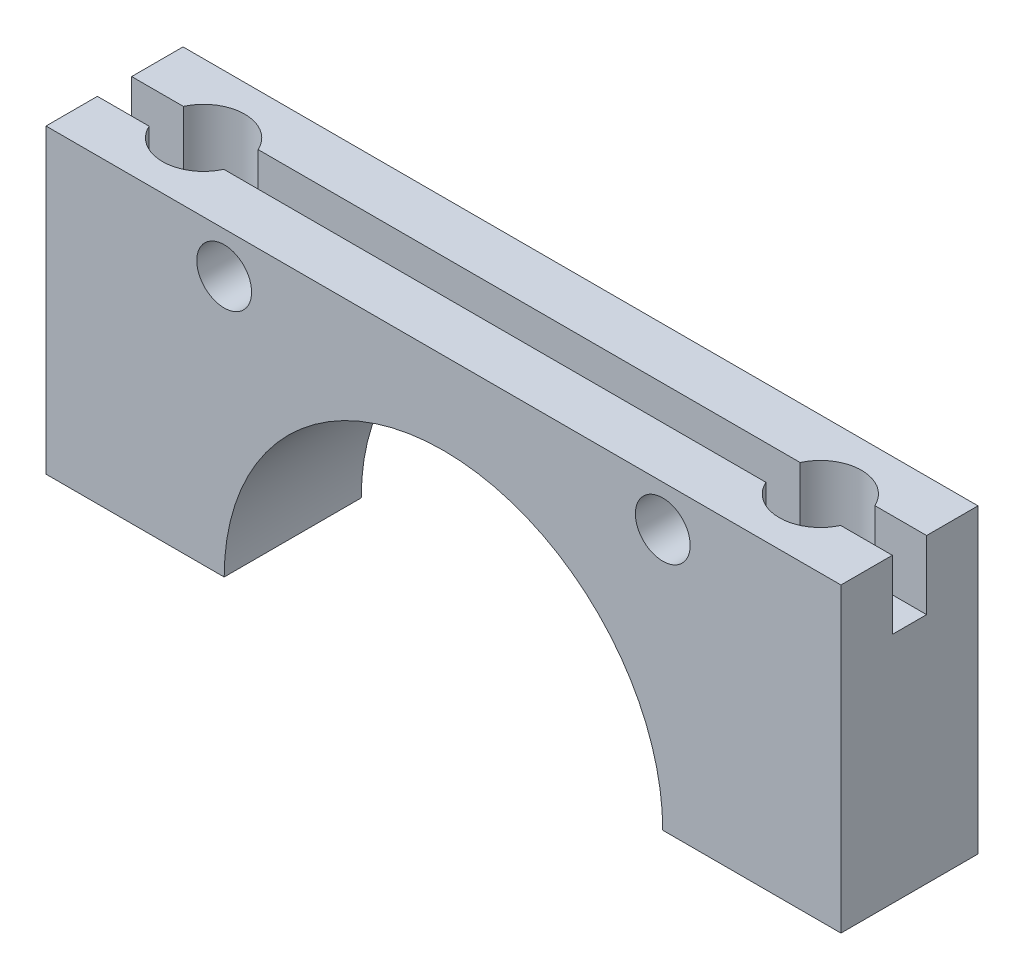
ISO-10303-21;
HEADER;
FILE_DESCRIPTION(('STEP AP214'),'2;1');
FILE_NAME('part.step','',(''),(''),'','','');
FILE_SCHEMA(('AUTOMOTIVE_DESIGN { 1 0 10303 214 1 1 1 1 }'));
ENDSEC;
DATA;
#1=APPLICATION_CONTEXT('core data for automotive mechanical design processes');
#2=APPLICATION_PROTOCOL_DEFINITION('international standard','automotive_design',2000,#1);
#3=PRODUCT_CONTEXT('',#1,'mechanical');
#4=PRODUCT('Part','Part','',(#3));
#5=PRODUCT_RELATED_PRODUCT_CATEGORY('part','',(#4));
#6=PRODUCT_DEFINITION_FORMATION('','',#4);
#7=PRODUCT_DEFINITION_CONTEXT('part definition',#1,'design');
#8=PRODUCT_DEFINITION('design','',#6,#7);
#9=PRODUCT_DEFINITION_SHAPE('','',#8);
#10=(LENGTH_UNIT() NAMED_UNIT(*) SI_UNIT(.MILLI.,.METRE.));
#11=(NAMED_UNIT(*) PLANE_ANGLE_UNIT() SI_UNIT($,.RADIAN.));
#12=(NAMED_UNIT(*) SI_UNIT($,.STERADIAN.) SOLID_ANGLE_UNIT());
#13=UNCERTAINTY_MEASURE_WITH_UNIT(LENGTH_MEASURE(1.E-05),#10,'distance_accuracy_value','');
#14=(GEOMETRIC_REPRESENTATION_CONTEXT(3) GLOBAL_UNCERTAINTY_ASSIGNED_CONTEXT((#13)) GLOBAL_UNIT_ASSIGNED_CONTEXT((#10,
#11,#12)) REPRESENTATION_CONTEXT('',''));
#15=CARTESIAN_POINT('',(0.,0.,0.));
#16=DIRECTION('',(0.,0.,1.));
#17=DIRECTION('',(1.,0.,0.));
#18=AXIS2_PLACEMENT_3D('',#15,#16,#17);
#19=CARTESIAN_POINT('',(-69.3342781396671,28.5744667064877,10.));
#20=DIRECTION('',(0.,-1.,0.));
#21=DIRECTION('',(0.,0.,-1.));
#22=AXIS2_PLACEMENT_3D('',#19,#20,#21);
#23=PLANE('',#22);
#24=DIRECTION('',(0.,0.,-1.));
#25=VECTOR('',#24,1.);
#26=CARTESIAN_POINT('',(-69.3342781396671,28.5744667064877,10.));
#27=LINE('',#26,#25);
#28=CARTESIAN_POINT('',(-69.3342781396671,28.5744667064877,3.75));
#29=VERTEX_POINT('',#28);
#30=CARTESIAN_POINT('',(-69.3342781396671,28.5744667064877,0.));
#31=VERTEX_POINT('',#30);
#32=EDGE_CURVE('E283',#29,#31,#27,.T.);
#33=ORIENTED_EDGE('',*,*,#32,.F.);
#34=DIRECTION('',(-1.,0.,0.));
#35=VECTOR('',#34,1.);
#36=CARTESIAN_POINT('',(-69.3342781396671,28.5744667064877,3.75));
#37=LINE('',#36,#35);
#38=CARTESIAN_POINT('',(-65.561456168326,28.5744667064877,3.75));
#39=VERTEX_POINT('',#38);
#40=EDGE_CURVE('E315',#39,#29,#37,.T.);
#41=ORIENTED_EDGE('',*,*,#40,.F.);
#42=CARTESIAN_POINT('',(-62.8342781396671,28.5744667064877,5.));
#43=DIRECTION('',(0.,1.,0.));
#44=DIRECTION('',(0.,0.,1.));
#45=AXIS2_PLACEMENT_3D('',#42,#43,#44);
#46=CIRCLE('',#45,3.);
#47=CARTESIAN_POINT('',(-60.1071001110082,28.5744667064877,3.75));
#48=VERTEX_POINT('',#47);
#49=EDGE_CURVE('E223',#48,#39,#46,.T.);
#50=ORIENTED_EDGE('',*,*,#49,.F.);
#51=CARTESIAN_POINT('',(-20.561456168326,28.5744667064877,3.75));
#52=VERTEX_POINT('',#51);
#53=EDGE_CURVE('E318',#52,#48,#37,.T.);
#54=ORIENTED_EDGE('',*,*,#53,.F.);
#55=CARTESIAN_POINT('',(-17.8342781396671,28.5744667064877,5.));
#56=DIRECTION('',(0.,1.,0.));
#57=DIRECTION('',(0.,0.,1.));
#58=AXIS2_PLACEMENT_3D('',#55,#56,#57);
#59=CIRCLE('',#58,3.);
#60=CARTESIAN_POINT('',(-15.1071001110082,28.5744667064877,3.75));
#61=VERTEX_POINT('',#60);
#62=EDGE_CURVE('E230',#61,#52,#59,.T.);
#63=ORIENTED_EDGE('',*,*,#62,.F.);
#64=CARTESIAN_POINT('',(-11.3342781396671,28.5744667064877,3.75));
#65=VERTEX_POINT('',#64);
#66=EDGE_CURVE('E188',#65,#61,#37,.T.);
#67=ORIENTED_EDGE('',*,*,#66,.F.);
#68=DIRECTION('',(0.,0.,-1.));
#69=VECTOR('',#68,1.);
#70=CARTESIAN_POINT('',(-11.3342781396671,28.5744667064877,10.));
#71=LINE('',#70,#69);
#72=CARTESIAN_POINT('',(-11.3342781396671,28.5744667064877,0.));
#73=VERTEX_POINT('',#72);
#74=EDGE_CURVE('E255',#65,#73,#71,.T.);
#75=ORIENTED_EDGE('',*,*,#74,.T.);
#76=DIRECTION('',(-1.,0.,0.));
#77=VECTOR('',#76,1.);
#78=CARTESIAN_POINT('',(-69.3342781396671,28.5744667064877,0.));
#79=LINE('',#78,#77);
#80=EDGE_CURVE('E236',#73,#31,#79,.T.);
#81=ORIENTED_EDGE('',*,*,#80,.T.);
#82=EDGE_LOOP('',(#33,#41,#50,#54,#63,#67,#75,#81));
#83=FACE_BOUND('',#82,.T.);
#84=ADVANCED_FACE('F36',(#83),#23,.F.);
#85=CARTESIAN_POINT('',(-17.8342781396671,33.5744667064877,5.));
#86=DIRECTION('',(0.,-1.,0.));
#87=DIRECTION('',(0.,0.,-1.));
#88=AXIS2_PLACEMENT_3D('',#85,#86,#87);
#89=CYLINDRICAL_SURFACE('',#88,1.6);
#90=CARTESIAN_POINT('',(-17.8342781396671,6.57446670648769,5.));
#91=DIRECTION('',(0.,-1.,0.));
#92=DIRECTION('',(0.,0.,-1.));
#93=AXIS2_PLACEMENT_3D('',#90,#91,#92);
#94=CIRCLE('',#93,1.6);
#95=CARTESIAN_POINT('',(-17.8342781396671,6.57446670648769,3.4));
#96=VERTEX_POINT('',#95);
#97=EDGE_CURVE('E237',#96,#96,#94,.T.);
#98=ORIENTED_EDGE('',*,*,#97,.T.);
#99=EDGE_LOOP('',(#98));
#100=FACE_BOUND('',#99,.T.);
#101=CARTESIAN_POINT('',(-17.8342781396671,13.5744667064877,5.));
#102=DIRECTION('',(0.,1.,0.));
#103=DIRECTION('',(0.,0.,1.));
#104=AXIS2_PLACEMENT_3D('',#101,#102,#103);
#105=CIRCLE('',#104,1.6);
#106=CARTESIAN_POINT('',(-17.8342781396671,13.5744667064877,6.6));
#107=VERTEX_POINT('',#106);
#108=EDGE_CURVE('E240',#107,#107,#105,.F.);
#109=ORIENTED_EDGE('',*,*,#108,.F.);
#110=EDGE_LOOP('',(#109));
#111=FACE_BOUND('',#110,.T.);
#112=ADVANCED_FACE('F406',(#100,#111),#89,.F.);
#113=CARTESIAN_POINT('',(-62.8342781396671,33.5744667064877,5.));
#114=DIRECTION('',(0.,-1.,0.));
#115=DIRECTION('',(0.,0.,-1.));
#116=AXIS2_PLACEMENT_3D('',#113,#114,#115);
#117=CYLINDRICAL_SURFACE('',#116,1.6);
#118=CARTESIAN_POINT('',(-62.8342781396671,6.57446670648769,5.));
#119=DIRECTION('',(0.,-1.,0.));
#120=DIRECTION('',(0.,0.,-1.));
#121=AXIS2_PLACEMENT_3D('',#118,#119,#120);
#122=CIRCLE('',#121,1.6);
#123=CARTESIAN_POINT('',(-62.8342781396671,6.57446670648769,3.4));
#124=VERTEX_POINT('',#123);
#125=EDGE_CURVE('E233',#124,#124,#122,.T.);
#126=ORIENTED_EDGE('',*,*,#125,.T.);
#127=EDGE_LOOP('',(#126));
#128=FACE_BOUND('',#127,.T.);
#129=CARTESIAN_POINT('',(-62.8342781396671,13.5744667064877,5.));
#130=DIRECTION('',(0.,1.,0.));
#131=DIRECTION('',(0.,0.,1.));
#132=AXIS2_PLACEMENT_3D('',#129,#130,#131);
#133=CIRCLE('',#132,1.6);
#134=CARTESIAN_POINT('',(-62.8342781396671,13.5744667064877,6.6));
#135=VERTEX_POINT('',#134);
#136=EDGE_CURVE('E222',#135,#135,#133,.F.);
#137=ORIENTED_EDGE('',*,*,#136,.F.);
#138=EDGE_LOOP('',(#137));
#139=FACE_BOUND('',#138,.T.);
#140=ADVANCED_FACE('F410',(#128,#139),#117,.F.);
#141=CARTESIAN_POINT('',(-11.3342781396671,28.5744667064877,10.));
#142=VERTEX_POINT('',#141);
#143=CARTESIAN_POINT('',(-11.3342781396671,28.5744667064877,6.25));
#144=VERTEX_POINT('',#143);
#145=EDGE_CURVE('E268',#142,#144,#71,.T.);
#146=ORIENTED_EDGE('',*,*,#145,.T.);
#147=DIRECTION('',(1.,0.,0.));
#148=VECTOR('',#147,1.);
#149=CARTESIAN_POINT('',(-69.3342781396671,28.5744667064877,6.25));
#150=LINE('',#149,#148);
#151=CARTESIAN_POINT('',(-15.1071001110082,28.5744667064877,6.25));
#152=VERTEX_POINT('',#151);
#153=EDGE_CURVE('E303',#152,#144,#150,.T.);
#154=ORIENTED_EDGE('',*,*,#153,.F.);
#155=CARTESIAN_POINT('',(-20.561456168326,28.5744667064877,6.25));
#156=VERTEX_POINT('',#155);
#157=EDGE_CURVE('E218',#156,#152,#59,.T.);
#158=ORIENTED_EDGE('',*,*,#157,.F.);
#159=CARTESIAN_POINT('',(-60.1071001110082,28.5744667064877,6.25));
#160=VERTEX_POINT('',#159);
#161=EDGE_CURVE('E316',#160,#156,#150,.T.);
#162=ORIENTED_EDGE('',*,*,#161,.F.);
#163=CARTESIAN_POINT('',(-65.561456168326,28.5744667064877,6.25));
#164=VERTEX_POINT('',#163);
#165=EDGE_CURVE('E224',#164,#160,#46,.T.);
#166=ORIENTED_EDGE('',*,*,#165,.F.);
#167=CARTESIAN_POINT('',(-69.3342781396671,28.5744667064877,6.25));
#168=VERTEX_POINT('',#167);
#169=EDGE_CURVE('E313',#168,#164,#150,.T.);
#170=ORIENTED_EDGE('',*,*,#169,.F.);
#171=CARTESIAN_POINT('',(-69.3342781396671,28.5744667064877,10.));
#172=VERTEX_POINT('',#171);
#173=EDGE_CURVE('E193',#172,#168,#27,.T.);
#174=ORIENTED_EDGE('',*,*,#173,.F.);
#175=DIRECTION('',(-1.,0.,0.));
#176=VECTOR('',#175,1.);
#177=CARTESIAN_POINT('',(-69.3342781396671,28.5744667064877,10.));
#178=LINE('',#177,#176);
#179=EDGE_CURVE('E241',#142,#172,#178,.T.);
#180=ORIENTED_EDGE('',*,*,#179,.F.);
#181=EDGE_LOOP('',(#146,#154,#158,#162,#166,#170,#174,#180));
#182=FACE_BOUND('',#181,.T.);
#183=ADVANCED_FACE('F38',(#182),#23,.F.);
#184=CARTESIAN_POINT('',(-69.3342781396671,6.57446670648769,10.));
#185=DIRECTION('',(1.,0.,0.));
#186=DIRECTION('',(0.,0.,-1.));
#187=AXIS2_PLACEMENT_3D('',#184,#185,#186);
#188=PLANE('',#187);
#189=DIRECTION('',(0.,0.,1.));
#190=VECTOR('',#189,1.);
#191=CARTESIAN_POINT('',(-69.3342781396671,23.5744667064877,3.75));
#192=LINE('',#191,#190);
#193=CARTESIAN_POINT('',(-69.3342781396671,23.5744667064877,3.75));
#194=VERTEX_POINT('',#193);
#195=CARTESIAN_POINT('',(-69.3342781396671,23.5744667064877,6.25));
#196=VERTEX_POINT('',#195);
#197=EDGE_CURVE('E180',#194,#196,#192,.T.);
#198=ORIENTED_EDGE('',*,*,#197,.F.);
#199=DIRECTION('',(0.,1.,0.));
#200=VECTOR('',#199,1.);
#201=CARTESIAN_POINT('',(-69.3342781396671,23.5744667064877,3.75));
#202=LINE('',#201,#200);
#203=EDGE_CURVE('E207',#194,#29,#202,.T.);
#204=ORIENTED_EDGE('',*,*,#203,.T.);
#205=ORIENTED_EDGE('',*,*,#32,.T.);
#206=DIRECTION('',(0.,-1.,0.));
#207=VECTOR('',#206,1.);
#208=CARTESIAN_POINT('',(-69.3342781396671,6.57446670648769,0.));
#209=LINE('',#208,#207);
#210=CARTESIAN_POINT('',(-69.3342781396671,6.57446670648769,0.));
#211=VERTEX_POINT('',#210);
#212=EDGE_CURVE('E258',#31,#211,#209,.T.);
#213=ORIENTED_EDGE('',*,*,#212,.T.);
#214=DIRECTION('',(0.,0.,-1.));
#215=VECTOR('',#214,1.);
#216=CARTESIAN_POINT('',(-69.3342781396671,6.57446670648769,10.));
#217=LINE('',#216,#215);
#218=CARTESIAN_POINT('',(-69.3342781396671,6.57446670648769,10.));
#219=VERTEX_POINT('',#218);
#220=EDGE_CURVE('E280',#219,#211,#217,.T.);
#221=ORIENTED_EDGE('',*,*,#220,.F.);
#222=DIRECTION('',(0.,-1.,0.));
#223=VECTOR('',#222,1.);
#224=CARTESIAN_POINT('',(-69.3342781396671,6.57446670648769,10.));
#225=LINE('',#224,#223);
#226=EDGE_CURVE('E244',#172,#219,#225,.T.);
#227=ORIENTED_EDGE('',*,*,#226,.F.);
#228=ORIENTED_EDGE('',*,*,#173,.T.);
#229=DIRECTION('',(0.,1.,0.));
#230=VECTOR('',#229,1.);
#231=CARTESIAN_POINT('',(-69.3342781396671,23.5744667064877,6.25));
#232=LINE('',#231,#230);
#233=EDGE_CURVE('E169',#196,#168,#232,.T.);
#234=ORIENTED_EDGE('',*,*,#233,.F.);
#235=EDGE_LOOP('',(#198,#204,#205,#213,#221,#227,#228,#234));
#236=FACE_BOUND('',#235,.T.);
#237=ADVANCED_FACE('F191',(#236),#188,.F.);
#238=CARTESIAN_POINT('',(-69.3342781396671,6.57446670648769,10.));
#239=DIRECTION('',(0.,1.,0.));
#240=DIRECTION('',(0.,0.,1.));
#241=AXIS2_PLACEMENT_3D('',#238,#239,#240);
#242=PLANE('',#241);
#243=ORIENTED_EDGE('',*,*,#125,.F.);
#244=EDGE_LOOP('',(#243));
#245=FACE_BOUND('',#244,.T.);
#246=DIRECTION('',(1.,0.,0.));
#247=VECTOR('',#246,1.);
#248=CARTESIAN_POINT('',(-69.3342781396671,6.57446670648769,0.));
#249=LINE('',#248,#247);
#250=CARTESIAN_POINT('',(-56.3342781396671,6.57446670648769,0.));
#251=VERTEX_POINT('',#250);
#252=EDGE_CURVE('E260',#211,#251,#249,.T.);
#253=ORIENTED_EDGE('',*,*,#252,.T.);
#254=DIRECTION('',(0.,0.,-1.));
#255=VECTOR('',#254,1.);
#256=CARTESIAN_POINT('',(-56.3342781396671,6.57446670648769,10.));
#257=LINE('',#256,#255);
#258=CARTESIAN_POINT('',(-56.3342781396671,6.57446670648769,10.));
#259=VERTEX_POINT('',#258);
#260=EDGE_CURVE('E277',#259,#251,#257,.T.);
#261=ORIENTED_EDGE('',*,*,#260,.F.);
#262=DIRECTION('',(1.,0.,0.));
#263=VECTOR('',#262,1.);
#264=CARTESIAN_POINT('',(-69.3342781396671,6.57446670648769,10.));
#265=LINE('',#264,#263);
#266=EDGE_CURVE('E247',#219,#259,#265,.T.);
#267=ORIENTED_EDGE('',*,*,#266,.F.);
#268=ORIENTED_EDGE('',*,*,#220,.T.);
#269=EDGE_LOOP('',(#253,#261,#267,#268));
#270=FACE_BOUND('',#269,.T.);
#271=ADVANCED_FACE('F395',(#245,#270),#242,.F.);
#272=CARTESIAN_POINT('',(-40.3342781396671,6.57446670648769,10.));
#273=DIRECTION('',(0.,0.,-1.));
#274=DIRECTION('',(-1.,0.,0.));
#275=AXIS2_PLACEMENT_3D('',#272,#273,#274);
#276=CYLINDRICAL_SURFACE('',#275,16.);
#277=CARTESIAN_POINT('',(-40.3342781396671,6.57446670648769,0.));
#278=DIRECTION('',(0.,0.,-1.));
#279=DIRECTION('',(-1.,0.,0.));
#280=AXIS2_PLACEMENT_3D('',#277,#278,#279);
#281=CIRCLE('',#280,16.);
#282=CARTESIAN_POINT('',(-24.3342781396671,6.57446670648769,0.));
#283=VERTEX_POINT('',#282);
#284=EDGE_CURVE('E262',#251,#283,#281,.T.);
#285=ORIENTED_EDGE('',*,*,#284,.T.);
#286=DIRECTION('',(0.,0.,-1.));
#287=VECTOR('',#286,1.);
#288=CARTESIAN_POINT('',(-24.3342781396671,6.57446670648769,10.));
#289=LINE('',#288,#287);
#290=CARTESIAN_POINT('',(-24.3342781396671,6.57446670648769,10.));
#291=VERTEX_POINT('',#290);
#292=EDGE_CURVE('E274',#291,#283,#289,.T.);
#293=ORIENTED_EDGE('',*,*,#292,.F.);
#294=CARTESIAN_POINT('',(-40.3342781396671,6.57446670648769,10.));
#295=DIRECTION('',(0.,0.,-1.));
#296=DIRECTION('',(-1.,0.,0.));
#297=AXIS2_PLACEMENT_3D('',#294,#295,#296);
#298=CIRCLE('',#297,16.);
#299=EDGE_CURVE('E249',#259,#291,#298,.T.);
#300=ORIENTED_EDGE('',*,*,#299,.F.);
#301=ORIENTED_EDGE('',*,*,#260,.T.);
#302=EDGE_LOOP('',(#285,#293,#300,#301));
#303=FACE_BOUND('',#302,.T.);
#304=ADVANCED_FACE('F391',(#303),#276,.F.);
#305=CARTESIAN_POINT('',(-11.3342781396671,6.57446670648769,10.));
#306=DIRECTION('',(0.,1.,0.));
#307=DIRECTION('',(0.,0.,1.));
#308=AXIS2_PLACEMENT_3D('',#305,#306,#307);
#309=PLANE('',#308);
#310=ORIENTED_EDGE('',*,*,#97,.F.);
#311=EDGE_LOOP('',(#310));
#312=FACE_BOUND('',#311,.T.);
#313=DIRECTION('',(1.,0.,0.));
#314=VECTOR('',#313,1.);
#315=CARTESIAN_POINT('',(-11.3342781396671,6.57446670648769,0.));
#316=LINE('',#315,#314);
#317=CARTESIAN_POINT('',(-11.3342781396671,6.57446670648769,0.));
#318=VERTEX_POINT('',#317);
#319=EDGE_CURVE('E264',#283,#318,#316,.T.);
#320=ORIENTED_EDGE('',*,*,#319,.T.);
#321=DIRECTION('',(0.,0.,-1.));
#322=VECTOR('',#321,1.);
#323=CARTESIAN_POINT('',(-11.3342781396671,6.57446670648769,10.));
#324=LINE('',#323,#322);
#325=CARTESIAN_POINT('',(-11.3342781396671,6.57446670648769,10.));
#326=VERTEX_POINT('',#325);
#327=EDGE_CURVE('E271',#326,#318,#324,.T.);
#328=ORIENTED_EDGE('',*,*,#327,.F.);
#329=DIRECTION('',(1.,0.,0.));
#330=VECTOR('',#329,1.);
#331=CARTESIAN_POINT('',(-11.3342781396671,6.57446670648769,10.));
#332=LINE('',#331,#330);
#333=EDGE_CURVE('E251',#291,#326,#332,.T.);
#334=ORIENTED_EDGE('',*,*,#333,.F.);
#335=ORIENTED_EDGE('',*,*,#292,.T.);
#336=EDGE_LOOP('',(#320,#328,#334,#335));
#337=FACE_BOUND('',#336,.T.);
#338=ADVANCED_FACE('F388',(#312,#337),#309,.F.);
#339=CARTESIAN_POINT('',(-11.3342781396671,28.5744667064877,10.));
#340=DIRECTION('',(-1.,0.,0.));
#341=DIRECTION('',(0.,0.,1.));
#342=AXIS2_PLACEMENT_3D('',#339,#340,#341);
#343=PLANE('',#342);
#344=ORIENTED_EDGE('',*,*,#74,.F.);
#345=DIRECTION('',(0.,1.,0.));
#346=VECTOR('',#345,1.);
#347=CARTESIAN_POINT('',(-11.3342781396671,23.5744667064877,3.75));
#348=LINE('',#347,#346);
#349=CARTESIAN_POINT('',(-11.3342781396671,23.5744667064877,3.75));
#350=VERTEX_POINT('',#349);
#351=EDGE_CURVE('E198',#350,#65,#348,.T.);
#352=ORIENTED_EDGE('',*,*,#351,.F.);
#353=DIRECTION('',(0.,0.,-1.));
#354=VECTOR('',#353,1.);
#355=CARTESIAN_POINT('',(-11.3342781396671,23.5744667064877,3.75));
#356=LINE('',#355,#354);
#357=CARTESIAN_POINT('',(-11.3342781396671,23.5744667064877,6.25));
#358=VERTEX_POINT('',#357);
#359=EDGE_CURVE('E175',#358,#350,#356,.T.);
#360=ORIENTED_EDGE('',*,*,#359,.F.);
#361=DIRECTION('',(0.,1.,0.));
#362=VECTOR('',#361,1.);
#363=CARTESIAN_POINT('',(-11.3342781396671,23.5744667064877,6.25));
#364=LINE('',#363,#362);
#365=EDGE_CURVE('E194',#358,#144,#364,.T.);
#366=ORIENTED_EDGE('',*,*,#365,.T.);
#367=ORIENTED_EDGE('',*,*,#145,.F.);
#368=DIRECTION('',(0.,1.,0.));
#369=VECTOR('',#368,1.);
#370=CARTESIAN_POINT('',(-11.3342781396671,28.5744667064877,10.));
#371=LINE('',#370,#369);
#372=EDGE_CURVE('E253',#326,#142,#371,.T.);
#373=ORIENTED_EDGE('',*,*,#372,.F.);
#374=ORIENTED_EDGE('',*,*,#327,.T.);
#375=DIRECTION('',(0.,1.,0.));
#376=VECTOR('',#375,1.);
#377=CARTESIAN_POINT('',(-11.3342781396671,28.5744667064877,0.));
#378=LINE('',#377,#376);
#379=EDGE_CURVE('E245',#318,#73,#378,.T.);
#380=ORIENTED_EDGE('',*,*,#379,.T.);
#381=EDGE_LOOP('',(#344,#352,#360,#366,#367,#373,#374,#380));
#382=FACE_BOUND('',#381,.T.);
#383=ADVANCED_FACE('F333',(#382),#343,.F.);
#384=CARTESIAN_POINT('',(-40.3342781396671,6.57446670648769,10.));
#385=DIRECTION('',(0.,0.,-1.));
#386=DIRECTION('',(-1.,0.,0.));
#387=AXIS2_PLACEMENT_3D('',#384,#385,#386);
#388=PLANE('',#387);
#389=CARTESIAN_POINT('',(-56.3342781396671,25.5744667064877,10.));
#390=DIRECTION('',(0.,0.,1.));
#391=DIRECTION('',(1.,0.,0.));
#392=AXIS2_PLACEMENT_3D('',#389,#390,#391);
#393=CIRCLE('',#392,2.);
#394=CARTESIAN_POINT('',(-54.3342781396671,25.5744667064877,10.));
#395=VERTEX_POINT('',#394);
#396=EDGE_CURVE('E299',#395,#395,#393,.T.);
#397=ORIENTED_EDGE('',*,*,#396,.F.);
#398=EDGE_LOOP('',(#397));
#399=FACE_BOUND('',#398,.T.);
#400=CARTESIAN_POINT('',(-24.3342781396671,25.5744667064877,10.));
#401=DIRECTION('',(0.,0.,1.));
#402=DIRECTION('',(1.,0.,0.));
#403=AXIS2_PLACEMENT_3D('',#400,#401,#402);
#404=CIRCLE('',#403,2.);
#405=CARTESIAN_POINT('',(-22.3342781396671,25.5744667064877,10.));
#406=VERTEX_POINT('',#405);
#407=EDGE_CURVE('E305',#406,#406,#404,.T.);
#408=ORIENTED_EDGE('',*,*,#407,.F.);
#409=EDGE_LOOP('',(#408));
#410=FACE_BOUND('',#409,.T.);
#411=ORIENTED_EDGE('',*,*,#179,.T.);
#412=ORIENTED_EDGE('',*,*,#226,.T.);
#413=ORIENTED_EDGE('',*,*,#266,.T.);
#414=ORIENTED_EDGE('',*,*,#299,.T.);
#415=ORIENTED_EDGE('',*,*,#333,.T.);
#416=ORIENTED_EDGE('',*,*,#372,.T.);
#417=EDGE_LOOP('',(#411,#412,#413,#414,#415,#416));
#418=FACE_BOUND('',#417,.T.);
#419=ADVANCED_FACE('F383',(#399,#410,#418),#388,.F.);
#420=CARTESIAN_POINT('',(-40.3342781396671,6.57446670648769,0.));
#421=DIRECTION('',(0.,0.,-1.));
#422=DIRECTION('',(-1.,0.,0.));
#423=AXIS2_PLACEMENT_3D('',#420,#421,#422);
#424=PLANE('',#423);
#425=ORIENTED_EDGE('',*,*,#80,.F.);
#426=ORIENTED_EDGE('',*,*,#379,.F.);
#427=ORIENTED_EDGE('',*,*,#319,.F.);
#428=ORIENTED_EDGE('',*,*,#284,.F.);
#429=ORIENTED_EDGE('',*,*,#252,.F.);
#430=ORIENTED_EDGE('',*,*,#212,.F.);
#431=EDGE_LOOP('',(#425,#426,#427,#428,#429,#430));
#432=FACE_BOUND('',#431,.T.);
#433=ADVANCED_FACE('F341',(#432),#424,.T.);
#434=CARTESIAN_POINT('',(-62.8342781396671,13.5744667064877,5.));
#435=DIRECTION('',(0.,1.,0.));
#436=DIRECTION('',(0.,0.,1.));
#437=AXIS2_PLACEMENT_3D('',#434,#435,#436);
#438=PLANE('',#437);
#439=CARTESIAN_POINT('',(-62.8342781396671,13.5744667064877,5.));
#440=DIRECTION('',(0.,1.,0.));
#441=DIRECTION('',(0.,0.,1.));
#442=AXIS2_PLACEMENT_3D('',#439,#440,#441);
#443=CIRCLE('',#442,3.);
#444=CARTESIAN_POINT('',(-62.8342781396671,13.5744667064877,8.));
#445=VERTEX_POINT('',#444);
#446=EDGE_CURVE('E219',#445,#445,#443,.T.);
#447=ORIENTED_EDGE('',*,*,#446,.T.);
#448=EDGE_LOOP('',(#447));
#449=FACE_BOUND('',#448,.T.);
#450=ORIENTED_EDGE('',*,*,#136,.T.);
#451=EDGE_LOOP('',(#450));
#452=FACE_BOUND('',#451,.T.);
#453=ADVANCED_FACE('F430',(#449,#452),#438,.T.);
#454=CARTESIAN_POINT('',(-62.8342781396671,13.5744667064877,5.));
#455=DIRECTION('',(0.,1.,0.));
#456=DIRECTION('',(0.,0.,1.));
#457=AXIS2_PLACEMENT_3D('',#454,#455,#456);
#458=CYLINDRICAL_SURFACE('',#457,3.);
#459=ORIENTED_EDGE('',*,*,#49,.T.);
#460=DIRECTION('',(0.,1.,0.));
#461=VECTOR('',#460,1.);
#462=CARTESIAN_POINT('',(-65.561456168326,13.5744667064877,3.75));
#463=LINE('',#462,#461);
#464=CARTESIAN_POINT('',(-65.561456168326,23.5744667064877,3.75));
#465=VERTEX_POINT('',#464);
#466=EDGE_CURVE('E215',#39,#465,#463,.F.);
#467=ORIENTED_EDGE('',*,*,#466,.T.);
#468=CARTESIAN_POINT('',(-62.8342781396671,23.5744667064877,5.));
#469=DIRECTION('',(0.,1.,0.));
#470=DIRECTION('',(0.,0.,1.));
#471=AXIS2_PLACEMENT_3D('',#468,#469,#470);
#472=CIRCLE('',#471,3.);
#473=CARTESIAN_POINT('',(-65.561456168326,23.5744667064877,6.25));
#474=VERTEX_POINT('',#473);
#475=EDGE_CURVE('E206',#474,#465,#472,.F.);
#476=ORIENTED_EDGE('',*,*,#475,.F.);
#477=DIRECTION('',(0.,1.,0.));
#478=VECTOR('',#477,1.);
#479=CARTESIAN_POINT('',(-65.561456168326,13.5744667064877,6.25));
#480=LINE('',#479,#478);
#481=EDGE_CURVE('E172',#474,#164,#480,.T.);
#482=ORIENTED_EDGE('',*,*,#481,.T.);
#483=ORIENTED_EDGE('',*,*,#165,.T.);
#484=DIRECTION('',(0.,1.,0.));
#485=VECTOR('',#484,1.);
#486=CARTESIAN_POINT('',(-60.1071001110082,13.5744667064877,6.25));
#487=LINE('',#486,#485);
#488=CARTESIAN_POINT('',(-60.1071001110082,23.5744667064877,6.25));
#489=VERTEX_POINT('',#488);
#490=EDGE_CURVE('E209',#160,#489,#487,.F.);
#491=ORIENTED_EDGE('',*,*,#490,.T.);
#492=CARTESIAN_POINT('',(-60.1071001110082,23.5744667064877,3.75));
#493=VERTEX_POINT('',#492);
#494=EDGE_CURVE('E204',#493,#489,#472,.F.);
#495=ORIENTED_EDGE('',*,*,#494,.F.);
#496=DIRECTION('',(0.,1.,0.));
#497=VECTOR('',#496,1.);
#498=CARTESIAN_POINT('',(-60.1071001110082,13.5744667064877,3.75));
#499=LINE('',#498,#497);
#500=EDGE_CURVE('E212',#493,#48,#499,.T.);
#501=ORIENTED_EDGE('',*,*,#500,.T.);
#502=EDGE_LOOP('',(#459,#467,#476,#482,#483,#491,#495,#501));
#503=FACE_BOUND('',#502,.T.);
#504=ORIENTED_EDGE('',*,*,#446,.F.);
#505=EDGE_LOOP('',(#504));
#506=FACE_BOUND('',#505,.T.);
#507=ADVANCED_FACE('F355',(#503,#506),#458,.F.);
#508=CARTESIAN_POINT('',(-17.8342781396671,13.5744667064877,5.));
#509=DIRECTION('',(0.,1.,0.));
#510=DIRECTION('',(0.,0.,1.));
#511=AXIS2_PLACEMENT_3D('',#508,#509,#510);
#512=PLANE('',#511);
#513=CARTESIAN_POINT('',(-17.8342781396671,13.5744667064877,5.));
#514=DIRECTION('',(0.,1.,0.));
#515=DIRECTION('',(0.,0.,1.));
#516=AXIS2_PLACEMENT_3D('',#513,#514,#515);
#517=CIRCLE('',#516,3.);
#518=CARTESIAN_POINT('',(-17.8342781396671,13.5744667064877,8.));
#519=VERTEX_POINT('',#518);
#520=EDGE_CURVE('E227',#519,#519,#517,.T.);
#521=ORIENTED_EDGE('',*,*,#520,.T.);
#522=EDGE_LOOP('',(#521));
#523=FACE_BOUND('',#522,.T.);
#524=ORIENTED_EDGE('',*,*,#108,.T.);
#525=EDGE_LOOP('',(#524));
#526=FACE_BOUND('',#525,.T.);
#527=ADVANCED_FACE('F441',(#523,#526),#512,.T.);
#528=CARTESIAN_POINT('',(-17.8342781396671,13.5744667064877,5.));
#529=DIRECTION('',(0.,1.,0.));
#530=DIRECTION('',(0.,0.,1.));
#531=AXIS2_PLACEMENT_3D('',#528,#529,#530);
#532=CYLINDRICAL_SURFACE('',#531,3.);
#533=ORIENTED_EDGE('',*,*,#62,.T.);
#534=DIRECTION('',(0.,1.,0.));
#535=VECTOR('',#534,1.);
#536=CARTESIAN_POINT('',(-20.561456168326,13.5744667064877,3.75));
#537=LINE('',#536,#535);
#538=CARTESIAN_POINT('',(-20.561456168326,23.5744667064877,3.75));
#539=VERTEX_POINT('',#538);
#540=EDGE_CURVE('E11',#52,#539,#537,.F.);
#541=ORIENTED_EDGE('',*,*,#540,.T.);
#542=CARTESIAN_POINT('',(-17.8342781396671,23.5744667064877,5.));
#543=DIRECTION('',(0.,1.,0.));
#544=DIRECTION('',(0.,0.,1.));
#545=AXIS2_PLACEMENT_3D('',#542,#543,#544);
#546=CIRCLE('',#545,3.);
#547=CARTESIAN_POINT('',(-20.561456168326,23.5744667064877,6.25));
#548=VERTEX_POINT('',#547);
#549=EDGE_CURVE('E292',#548,#539,#546,.F.);
#550=ORIENTED_EDGE('',*,*,#549,.F.);
#551=DIRECTION('',(0.,1.,0.));
#552=VECTOR('',#551,1.);
#553=CARTESIAN_POINT('',(-20.561456168326,13.5744667064877,6.25));
#554=LINE('',#553,#552);
#555=EDGE_CURVE('E45',#548,#156,#554,.T.);
#556=ORIENTED_EDGE('',*,*,#555,.T.);
#557=ORIENTED_EDGE('',*,*,#157,.T.);
#558=DIRECTION('',(0.,1.,0.));
#559=VECTOR('',#558,1.);
#560=CARTESIAN_POINT('',(-15.1071001110082,13.5744667064877,6.25));
#561=LINE('',#560,#559);
#562=CARTESIAN_POINT('',(-15.1071001110082,23.5744667064877,6.25));
#563=VERTEX_POINT('',#562);
#564=EDGE_CURVE('E291',#152,#563,#561,.F.);
#565=ORIENTED_EDGE('',*,*,#564,.T.);
#566=CARTESIAN_POINT('',(-15.1071001110082,23.5744667064877,3.75));
#567=VERTEX_POINT('',#566);
#568=EDGE_CURVE('E285',#567,#563,#546,.F.);
#569=ORIENTED_EDGE('',*,*,#568,.F.);
#570=DIRECTION('',(0.,1.,0.));
#571=VECTOR('',#570,1.);
#572=CARTESIAN_POINT('',(-15.1071001110082,13.5744667064877,3.75));
#573=LINE('',#572,#571);
#574=EDGE_CURVE('E295',#567,#61,#573,.T.);
#575=ORIENTED_EDGE('',*,*,#574,.T.);
#576=EDGE_LOOP('',(#533,#541,#550,#556,#557,#565,#569,#575));
#577=FACE_BOUND('',#576,.T.);
#578=ORIENTED_EDGE('',*,*,#520,.F.);
#579=EDGE_LOOP('',(#578));
#580=FACE_BOUND('',#579,.T.);
#581=ADVANCED_FACE('F372',(#577,#580),#532,.F.);
#582=CARTESIAN_POINT('',(0.,23.5744667064877,0.));
#583=DIRECTION('',(0.,1.,0.));
#584=DIRECTION('',(0.,0.,1.));
#585=AXIS2_PLACEMENT_3D('',#582,#583,#584);
#586=PLANE('',#585);
#587=ORIENTED_EDGE('',*,*,#568,.T.);
#588=DIRECTION('',(1.,0.,0.));
#589=VECTOR('',#588,1.);
#590=CARTESIAN_POINT('',(-69.3342781396671,23.5744667064877,6.25));
#591=LINE('',#590,#589);
#592=EDGE_CURVE('E187',#563,#358,#591,.T.);
#593=ORIENTED_EDGE('',*,*,#592,.T.);
#594=ORIENTED_EDGE('',*,*,#359,.T.);
#595=DIRECTION('',(-1.,0.,0.));
#596=VECTOR('',#595,1.);
#597=CARTESIAN_POINT('',(-69.3342781396671,23.5744667064877,3.75));
#598=LINE('',#597,#596);
#599=EDGE_CURVE('E195',#350,#567,#598,.T.);
#600=ORIENTED_EDGE('',*,*,#599,.T.);
#601=EDGE_LOOP('',(#587,#593,#594,#600));
#602=FACE_BOUND('',#601,.T.);
#603=ADVANCED_FACE('F375',(#602),#586,.T.);
#604=CARTESIAN_POINT('',(-69.3342781396671,23.5744667064877,6.25));
#605=DIRECTION('',(0.,0.,1.));
#606=DIRECTION('',(1.,0.,0.));
#607=AXIS2_PLACEMENT_3D('',#604,#605,#606);
#608=PLANE('',#607);
#609=ORIENTED_EDGE('',*,*,#153,.T.);
#610=ORIENTED_EDGE('',*,*,#365,.F.);
#611=ORIENTED_EDGE('',*,*,#592,.F.);
#612=ORIENTED_EDGE('',*,*,#564,.F.);
#613=EDGE_LOOP('',(#609,#610,#611,#612));
#614=FACE_BOUND('',#613,.T.);
#615=ADVANCED_FACE('F377',(#614),#608,.F.);
#616=CARTESIAN_POINT('',(-69.3342781396671,23.5744667064877,3.75));
#617=DIRECTION('',(0.,0.,-1.));
#618=DIRECTION('',(-1.,0.,0.));
#619=AXIS2_PLACEMENT_3D('',#616,#617,#618);
#620=PLANE('',#619);
#621=ORIENTED_EDGE('',*,*,#599,.F.);
#622=ORIENTED_EDGE('',*,*,#351,.T.);
#623=ORIENTED_EDGE('',*,*,#66,.T.);
#624=ORIENTED_EDGE('',*,*,#574,.F.);
#625=EDGE_LOOP('',(#621,#622,#623,#624));
#626=FACE_BOUND('',#625,.T.);
#627=ADVANCED_FACE('F323',(#626),#620,.F.);
#628=CARTESIAN_POINT('',(-56.3342781396671,23.5744667064877,6.25));
#629=VERTEX_POINT('',#628);
#630=EDGE_CURVE('E176',#489,#629,#591,.T.);
#631=ORIENTED_EDGE('',*,*,#630,.T.);
#632=CARTESIAN_POINT('',(-24.3342781396671,23.5744667064877,6.25));
#633=VERTEX_POINT('',#632);
#634=EDGE_CURVE('E364',#629,#633,#591,.T.);
#635=ORIENTED_EDGE('',*,*,#634,.T.);
#636=EDGE_CURVE('E178',#633,#548,#591,.T.);
#637=ORIENTED_EDGE('',*,*,#636,.T.);
#638=ORIENTED_EDGE('',*,*,#549,.T.);
#639=EDGE_CURVE('E200',#539,#493,#598,.T.);
#640=ORIENTED_EDGE('',*,*,#639,.T.);
#641=ORIENTED_EDGE('',*,*,#494,.T.);
#642=EDGE_LOOP('',(#631,#635,#637,#638,#640,#641));
#643=FACE_BOUND('',#642,.T.);
#644=ADVANCED_FACE('F360',(#643),#586,.T.);
#645=ORIENTED_EDGE('',*,*,#634,.F.);
#646=CARTESIAN_POINT('',(-56.3342781396671,25.5744667064877,6.25));
#647=DIRECTION('',(0.,0.,1.));
#648=DIRECTION('',(1.,0.,0.));
#649=AXIS2_PLACEMENT_3D('',#646,#647,#648);
#650=CIRCLE('',#649,2.);
#651=EDGE_CURVE('E40',#629,#629,#650,.T.);
#652=ORIENTED_EDGE('',*,*,#651,.T.);
#653=ORIENTED_EDGE('',*,*,#630,.F.);
#654=ORIENTED_EDGE('',*,*,#490,.F.);
#655=ORIENTED_EDGE('',*,*,#161,.T.);
#656=ORIENTED_EDGE('',*,*,#555,.F.);
#657=ORIENTED_EDGE('',*,*,#636,.F.);
#658=CARTESIAN_POINT('',(-24.3342781396671,25.5744667064877,6.25));
#659=DIRECTION('',(0.,0.,1.));
#660=DIRECTION('',(1.,0.,0.));
#661=AXIS2_PLACEMENT_3D('',#658,#659,#660);
#662=CIRCLE('',#661,2.);
#663=EDGE_CURVE('E51',#633,#633,#662,.T.);
#664=ORIENTED_EDGE('',*,*,#663,.T.);
#665=EDGE_LOOP('',(#645,#652,#653,#654,#655,#656,#657,#664));
#666=FACE_BOUND('',#665,.T.);
#667=ADVANCED_FACE('F362',(#666),#608,.F.);
#668=ORIENTED_EDGE('',*,*,#639,.F.);
#669=ORIENTED_EDGE('',*,*,#540,.F.);
#670=ORIENTED_EDGE('',*,*,#53,.T.);
#671=ORIENTED_EDGE('',*,*,#500,.F.);
#672=EDGE_LOOP('',(#668,#669,#670,#671));
#673=FACE_BOUND('',#672,.T.);
#674=ADVANCED_FACE('F351',(#673),#620,.F.);
#675=ORIENTED_EDGE('',*,*,#40,.T.);
#676=ORIENTED_EDGE('',*,*,#203,.F.);
#677=EDGE_CURVE('E183',#465,#194,#598,.T.);
#678=ORIENTED_EDGE('',*,*,#677,.F.);
#679=ORIENTED_EDGE('',*,*,#466,.F.);
#680=EDGE_LOOP('',(#675,#676,#678,#679));
#681=FACE_BOUND('',#680,.T.);
#682=ADVANCED_FACE('F348',(#681),#620,.F.);
#683=EDGE_CURVE('E165',#196,#474,#591,.T.);
#684=ORIENTED_EDGE('',*,*,#683,.F.);
#685=ORIENTED_EDGE('',*,*,#233,.T.);
#686=ORIENTED_EDGE('',*,*,#169,.T.);
#687=ORIENTED_EDGE('',*,*,#481,.F.);
#688=EDGE_LOOP('',(#684,#685,#686,#687));
#689=FACE_BOUND('',#688,.T.);
#690=ADVANCED_FACE('F167',(#689),#608,.F.);
#691=ORIENTED_EDGE('',*,*,#475,.T.);
#692=ORIENTED_EDGE('',*,*,#677,.T.);
#693=ORIENTED_EDGE('',*,*,#197,.T.);
#694=ORIENTED_EDGE('',*,*,#683,.T.);
#695=EDGE_LOOP('',(#691,#692,#693,#694));
#696=FACE_BOUND('',#695,.T.);
#697=ADVANCED_FACE('F181',(#696),#586,.T.);
#698=CARTESIAN_POINT('',(-24.3342781396671,25.5744667064877,5.));
#699=DIRECTION('',(0.,0.,1.));
#700=DIRECTION('',(1.,0.,0.));
#701=AXIS2_PLACEMENT_3D('',#698,#699,#700);
#702=CYLINDRICAL_SURFACE('',#701,2.);
#703=ORIENTED_EDGE('',*,*,#407,.T.);
#704=EDGE_LOOP('',(#703));
#705=FACE_BOUND('',#704,.T.);
#706=ORIENTED_EDGE('',*,*,#663,.F.);
#707=EDGE_LOOP('',(#706));
#708=FACE_BOUND('',#707,.T.);
#709=ADVANCED_FACE('F459',(#705,#708),#702,.F.);
#710=CARTESIAN_POINT('',(-56.3342781396671,25.5744667064877,5.));
#711=DIRECTION('',(0.,0.,1.));
#712=DIRECTION('',(1.,0.,0.));
#713=AXIS2_PLACEMENT_3D('',#710,#711,#712);
#714=CYLINDRICAL_SURFACE('',#713,2.);
#715=ORIENTED_EDGE('',*,*,#396,.T.);
#716=EDGE_LOOP('',(#715));
#717=FACE_BOUND('',#716,.T.);
#718=ORIENTED_EDGE('',*,*,#651,.F.);
#719=EDGE_LOOP('',(#718));
#720=FACE_BOUND('',#719,.T.);
#721=ADVANCED_FACE('F462',(#717,#720),#714,.F.);
#722=CLOSED_SHELL('',(#84,#112,#140,#183,#237,#271,#304,#338,#383,#419,#433,#453,#507,#527,#581,
#603,#615,#627,#644,#667,#674,#682,#690,#697,#709,#721));
#723=MANIFOLD_SOLID_BREP('B2',#722);
#724=ADVANCED_BREP_SHAPE_REPRESENTATION('',(#18,#723),#14);
#725=SHAPE_DEFINITION_REPRESENTATION(#9,#724);
ENDSEC;
END-ISO-10303-21;
